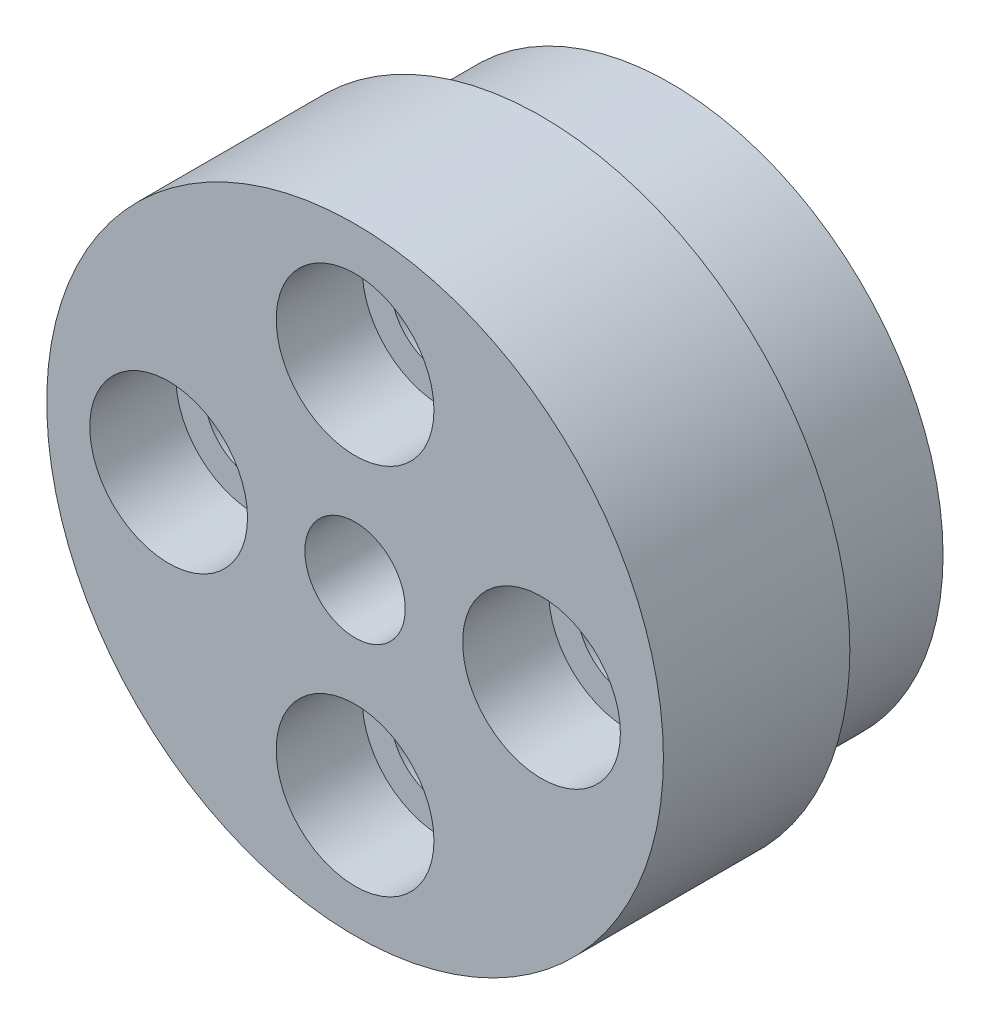
ISO-10303-21;
HEADER;
FILE_DESCRIPTION(('STEP AP214'),'2;1');
FILE_NAME('part.step','',(''),(''),'','','');
FILE_SCHEMA(('AUTOMOTIVE_DESIGN { 1 0 10303 214 1 1 1 1 }'));
ENDSEC;
DATA;
#1=APPLICATION_CONTEXT('core data for automotive mechanical design processes');
#2=APPLICATION_PROTOCOL_DEFINITION('international standard','automotive_design',2000,#1);
#3=PRODUCT_CONTEXT('',#1,'mechanical');
#4=PRODUCT('Part','Part','',(#3));
#5=PRODUCT_RELATED_PRODUCT_CATEGORY('part','',(#4));
#6=PRODUCT_DEFINITION_FORMATION('','',#4);
#7=PRODUCT_DEFINITION_CONTEXT('part definition',#1,'design');
#8=PRODUCT_DEFINITION('design','',#6,#7);
#9=PRODUCT_DEFINITION_SHAPE('','',#8);
#10=(LENGTH_UNIT() NAMED_UNIT(*) SI_UNIT(.MILLI.,.METRE.));
#11=(NAMED_UNIT(*) PLANE_ANGLE_UNIT() SI_UNIT($,.RADIAN.));
#12=(NAMED_UNIT(*) SI_UNIT($,.STERADIAN.) SOLID_ANGLE_UNIT());
#13=UNCERTAINTY_MEASURE_WITH_UNIT(LENGTH_MEASURE(1.E-05),#10,'distance_accuracy_value','');
#14=(GEOMETRIC_REPRESENTATION_CONTEXT(3) GLOBAL_UNCERTAINTY_ASSIGNED_CONTEXT((#13)) GLOBAL_UNIT_ASSIGNED_CONTEXT((#10,
#11,#12)) REPRESENTATION_CONTEXT('',''));
#15=CARTESIAN_POINT('',(0.,0.,0.));
#16=DIRECTION('',(0.,0.,1.));
#17=DIRECTION('',(1.,0.,0.));
#18=AXIS2_PLACEMENT_3D('',#15,#16,#17);
#19=CARTESIAN_POINT('',(0.,-6.5,0.));
#20=DIRECTION('',(0.,0.,-1.));
#21=DIRECTION('',(-1.,0.,0.));
#22=AXIS2_PLACEMENT_3D('',#19,#20,#21);
#23=CYLINDRICAL_SURFACE('',#22,1.75);
#24=CARTESIAN_POINT('',(0.,-6.5,-11.));
#25=DIRECTION('',(0.,0.,-1.));
#26=DIRECTION('',(-1.,0.,0.));
#27=AXIS2_PLACEMENT_3D('',#24,#25,#26);
#28=CIRCLE('',#27,1.75);
#29=CARTESIAN_POINT('',(-1.75,-6.5,-11.));
#30=VERTEX_POINT('',#29);
#31=EDGE_CURVE('E69',#30,#30,#28,.T.);
#32=ORIENTED_EDGE('',*,*,#31,.T.);
#33=EDGE_LOOP('',(#32));
#34=FACE_BOUND('',#33,.T.);
#35=CARTESIAN_POINT('',(0.,-6.5,-3.));
#36=DIRECTION('',(0.,0.,1.));
#37=DIRECTION('',(1.,0.,0.));
#38=AXIS2_PLACEMENT_3D('',#35,#36,#37);
#39=CIRCLE('',#38,1.75);
#40=CARTESIAN_POINT('',(1.75,-6.5,-3.));
#41=VERTEX_POINT('',#40);
#42=EDGE_CURVE('E84',#41,#41,#39,.T.);
#43=ORIENTED_EDGE('',*,*,#42,.T.);
#44=EDGE_LOOP('',(#43));
#45=FACE_BOUND('',#44,.T.);
#46=ADVANCED_FACE('F33',(#34,#45),#23,.F.);
#47=CARTESIAN_POINT('',(-6.5,0.,0.));
#48=DIRECTION('',(0.,0.,-1.));
#49=DIRECTION('',(-1.,0.,0.));
#50=AXIS2_PLACEMENT_3D('',#47,#48,#49);
#51=CYLINDRICAL_SURFACE('',#50,1.75);
#52=CARTESIAN_POINT('',(-6.5,0.,-11.));
#53=DIRECTION('',(0.,0.,-1.));
#54=DIRECTION('',(-1.,0.,0.));
#55=AXIS2_PLACEMENT_3D('',#52,#53,#54);
#56=CIRCLE('',#55,1.75);
#57=CARTESIAN_POINT('',(-8.25,0.,-11.));
#58=VERTEX_POINT('',#57);
#59=EDGE_CURVE('E62',#58,#58,#56,.T.);
#60=ORIENTED_EDGE('',*,*,#59,.T.);
#61=EDGE_LOOP('',(#60));
#62=FACE_BOUND('',#61,.T.);
#63=CARTESIAN_POINT('',(-6.5,0.,-3.));
#64=DIRECTION('',(0.,0.,1.));
#65=DIRECTION('',(1.,0.,0.));
#66=AXIS2_PLACEMENT_3D('',#63,#64,#65);
#67=CIRCLE('',#66,1.75);
#68=CARTESIAN_POINT('',(-4.75,0.,-3.));
#69=VERTEX_POINT('',#68);
#70=EDGE_CURVE('E87',#69,#69,#67,.T.);
#71=ORIENTED_EDGE('',*,*,#70,.T.);
#72=EDGE_LOOP('',(#71));
#73=FACE_BOUND('',#72,.T.);
#74=ADVANCED_FACE('F160',(#62,#73),#51,.F.);
#75=CARTESIAN_POINT('',(6.5,0.,0.));
#76=DIRECTION('',(0.,0.,-1.));
#77=DIRECTION('',(-1.,0.,0.));
#78=AXIS2_PLACEMENT_3D('',#75,#76,#77);
#79=CYLINDRICAL_SURFACE('',#78,1.75);
#80=CARTESIAN_POINT('',(6.5,0.,-11.));
#81=DIRECTION('',(0.,0.,-1.));
#82=DIRECTION('',(-1.,0.,0.));
#83=AXIS2_PLACEMENT_3D('',#80,#81,#82);
#84=CIRCLE('',#83,1.75);
#85=CARTESIAN_POINT('',(4.75,0.,-11.));
#86=VERTEX_POINT('',#85);
#87=EDGE_CURVE('E57',#86,#86,#84,.T.);
#88=ORIENTED_EDGE('',*,*,#87,.T.);
#89=EDGE_LOOP('',(#88));
#90=FACE_BOUND('',#89,.T.);
#91=CARTESIAN_POINT('',(6.5,0.,-3.));
#92=DIRECTION('',(0.,0.,1.));
#93=DIRECTION('',(1.,0.,0.));
#94=AXIS2_PLACEMENT_3D('',#91,#92,#93);
#95=CIRCLE('',#94,1.75);
#96=CARTESIAN_POINT('',(8.25,0.,-3.));
#97=VERTEX_POINT('',#96);
#98=EDGE_CURVE('E105',#97,#97,#95,.T.);
#99=ORIENTED_EDGE('',*,*,#98,.T.);
#100=EDGE_LOOP('',(#99));
#101=FACE_BOUND('',#100,.T.);
#102=ADVANCED_FACE('F116',(#90,#101),#79,.F.);
#103=CARTESIAN_POINT('',(0.,6.5,0.));
#104=DIRECTION('',(0.,0.,-1.));
#105=DIRECTION('',(-1.,0.,0.));
#106=AXIS2_PLACEMENT_3D('',#103,#104,#105);
#107=CYLINDRICAL_SURFACE('',#106,1.75);
#108=CARTESIAN_POINT('',(0.,6.5,-11.));
#109=DIRECTION('',(0.,0.,-1.));
#110=DIRECTION('',(-1.,0.,0.));
#111=AXIS2_PLACEMENT_3D('',#108,#109,#110);
#112=CIRCLE('',#111,1.75);
#113=CARTESIAN_POINT('',(-1.75,6.5,-11.));
#114=VERTEX_POINT('',#113);
#115=EDGE_CURVE('E53',#114,#114,#112,.T.);
#116=ORIENTED_EDGE('',*,*,#115,.T.);
#117=EDGE_LOOP('',(#116));
#118=FACE_BOUND('',#117,.T.);
#119=CARTESIAN_POINT('',(0.,6.5,-3.));
#120=DIRECTION('',(0.,0.,1.));
#121=DIRECTION('',(1.,0.,0.));
#122=AXIS2_PLACEMENT_3D('',#119,#120,#121);
#123=CIRCLE('',#122,1.75);
#124=CARTESIAN_POINT('',(1.75,6.5,-3.));
#125=VERTEX_POINT('',#124);
#126=EDGE_CURVE('E96',#125,#125,#123,.T.);
#127=ORIENTED_EDGE('',*,*,#126,.T.);
#128=EDGE_LOOP('',(#127));
#129=FACE_BOUND('',#128,.T.);
#130=ADVANCED_FACE('F182',(#118,#129),#107,.F.);
#131=CARTESIAN_POINT('',(0.,0.,-11.));
#132=DIRECTION('',(0.,0.,1.));
#133=DIRECTION('',(1.,0.,0.));
#134=AXIS2_PLACEMENT_3D('',#131,#132,#133);
#135=CYLINDRICAL_SURFACE('',#134,9.5);
#136=CARTESIAN_POINT('',(0.,0.,-11.));
#137=DIRECTION('',(0.,0.,1.));
#138=DIRECTION('',(1.,0.,0.));
#139=AXIS2_PLACEMENT_3D('',#136,#137,#138);
#140=CIRCLE('',#139,9.5);
#141=CARTESIAN_POINT('',(9.5,0.,-11.));
#142=VERTEX_POINT('',#141);
#143=EDGE_CURVE('E10',#142,#142,#140,.T.);
#144=ORIENTED_EDGE('',*,*,#143,.T.);
#145=EDGE_LOOP('',(#144));
#146=FACE_BOUND('',#145,.T.);
#147=CARTESIAN_POINT('',(0.,0.,-6.5));
#148=DIRECTION('',(0.,0.,1.));
#149=DIRECTION('',(1.,0.,0.));
#150=AXIS2_PLACEMENT_3D('',#147,#148,#149);
#151=CIRCLE('',#150,9.5);
#152=CARTESIAN_POINT('',(9.5,0.,-6.5));
#153=VERTEX_POINT('',#152);
#154=EDGE_CURVE('E44',#153,#153,#151,.T.);
#155=ORIENTED_EDGE('',*,*,#154,.F.);
#156=EDGE_LOOP('',(#155));
#157=FACE_BOUND('',#156,.T.);
#158=ADVANCED_FACE('F35',(#146,#157),#135,.T.);
#159=CARTESIAN_POINT('',(0.,0.,-11.));
#160=DIRECTION('',(0.,0.,1.));
#161=DIRECTION('',(1.,0.,0.));
#162=AXIS2_PLACEMENT_3D('',#159,#160,#161);
#163=PLANE('',#162);
#164=CARTESIAN_POINT('',(0.,0.,-11.));
#165=DIRECTION('',(0.,0.,-1.));
#166=DIRECTION('',(-1.,0.,0.));
#167=AXIS2_PLACEMENT_3D('',#164,#165,#166);
#168=CIRCLE('',#167,1.75);
#169=CARTESIAN_POINT('',(-1.75,0.,-11.));
#170=VERTEX_POINT('',#169);
#171=EDGE_CURVE('E65',#170,#170,#168,.T.);
#172=ORIENTED_EDGE('',*,*,#171,.F.);
#173=EDGE_LOOP('',(#172));
#174=FACE_BOUND('',#173,.T.);
#175=ORIENTED_EDGE('',*,*,#115,.F.);
#176=EDGE_LOOP('',(#175));
#177=FACE_BOUND('',#176,.T.);
#178=ORIENTED_EDGE('',*,*,#87,.F.);
#179=EDGE_LOOP('',(#178));
#180=FACE_BOUND('',#179,.T.);
#181=ORIENTED_EDGE('',*,*,#59,.F.);
#182=EDGE_LOOP('',(#181));
#183=FACE_BOUND('',#182,.T.);
#184=ORIENTED_EDGE('',*,*,#31,.F.);
#185=EDGE_LOOP('',(#184));
#186=FACE_BOUND('',#185,.T.);
#187=ORIENTED_EDGE('',*,*,#143,.F.);
#188=EDGE_LOOP('',(#187));
#189=FACE_BOUND('',#188,.T.);
#190=ADVANCED_FACE('F176',(#174,#177,#180,#183,#186,#189),#163,.F.);
#191=CARTESIAN_POINT('',(0.,0.,-6.5));
#192=DIRECTION('',(0.,0.,1.));
#193=DIRECTION('',(1.,0.,0.));
#194=AXIS2_PLACEMENT_3D('',#191,#192,#193);
#195=CYLINDRICAL_SURFACE('',#194,10.75);
#196=CARTESIAN_POINT('',(0.,0.,-6.5));
#197=DIRECTION('',(0.,0.,1.));
#198=DIRECTION('',(1.,0.,0.));
#199=AXIS2_PLACEMENT_3D('',#196,#197,#198);
#200=CIRCLE('',#199,10.75);
#201=CARTESIAN_POINT('',(10.75,0.,-6.5));
#202=VERTEX_POINT('',#201);
#203=EDGE_CURVE('E40',#202,#202,#200,.T.);
#204=CARTESIAN_POINT('',(0.,0.,0.));
#205=DIRECTION('',(0.,0.,1.));
#206=DIRECTION('',(1.,0.,0.));
#207=AXIS2_PLACEMENT_3D('',#204,#205,#206);
#208=CIRCLE('',#207,10.75);
#209=CARTESIAN_POINT('',(10.75,0.,0.));
#210=VERTEX_POINT('',#209);
#211=EDGE_CURVE('E49',#210,#210,#208,.T.);
#212=CARTESIAN_POINT('',(10.75,0.,-6.5));
#213=CARTESIAN_POINT('',(10.75,0.,-6.43229166666667));
#214=CARTESIAN_POINT('',(10.75,0.,-6.36458333333333));
#215=CARTESIAN_POINT('',(10.75,0.,-6.22916666666667));
#216=CARTESIAN_POINT('',(10.75,0.,-6.16145833333333));
#217=CARTESIAN_POINT('',(10.75,0.,-6.02604166666667));
#218=CARTESIAN_POINT('',(10.75,0.,-5.95833333333333));
#219=CARTESIAN_POINT('',(10.75,0.,-5.82291666666667));
#220=CARTESIAN_POINT('',(10.75,0.,-5.75520833333333));
#221=CARTESIAN_POINT('',(10.75,0.,-5.61979166666667));
#222=CARTESIAN_POINT('',(10.75,0.,-5.55208333333333));
#223=CARTESIAN_POINT('',(10.75,0.,-5.41666666666667));
#224=CARTESIAN_POINT('',(10.75,0.,-5.34895833333333));
#225=CARTESIAN_POINT('',(10.75,0.,-5.21354166666667));
#226=CARTESIAN_POINT('',(10.75,0.,-5.14583333333333));
#227=CARTESIAN_POINT('',(10.75,0.,-5.01041666666667));
#228=CARTESIAN_POINT('',(10.75,0.,-4.94270833333333));
#229=CARTESIAN_POINT('',(10.75,0.,-4.80729166666667));
#230=CARTESIAN_POINT('',(10.75,0.,-4.73958333333333));
#231=CARTESIAN_POINT('',(10.75,0.,-4.60416666666667));
#232=CARTESIAN_POINT('',(10.75,0.,-4.53645833333333));
#233=CARTESIAN_POINT('',(10.75,0.,-4.40104166666667));
#234=CARTESIAN_POINT('',(10.75,0.,-4.33333333333333));
#235=CARTESIAN_POINT('',(10.75,0.,-4.19791666666667));
#236=CARTESIAN_POINT('',(10.75,0.,-4.13020833333333));
#237=CARTESIAN_POINT('',(10.75,0.,-3.99479166666667));
#238=CARTESIAN_POINT('',(10.75,0.,-3.92708333333333));
#239=CARTESIAN_POINT('',(10.75,0.,-3.79166666666667));
#240=CARTESIAN_POINT('',(10.75,0.,-3.72395833333333));
#241=CARTESIAN_POINT('',(10.75,0.,-3.58854166666667));
#242=CARTESIAN_POINT('',(10.75,0.,-3.52083333333333));
#243=CARTESIAN_POINT('',(10.75,0.,-3.38541666666667));
#244=CARTESIAN_POINT('',(10.75,0.,-3.31770833333333));
#245=CARTESIAN_POINT('',(10.75,0.,-3.18229166666667));
#246=CARTESIAN_POINT('',(10.75,0.,-3.11458333333333));
#247=CARTESIAN_POINT('',(10.75,0.,-2.97916666666667));
#248=CARTESIAN_POINT('',(10.75,0.,-2.91145833333333));
#249=CARTESIAN_POINT('',(10.75,0.,-2.77604166666667));
#250=CARTESIAN_POINT('',(10.75,0.,-2.70833333333333));
#251=CARTESIAN_POINT('',(10.75,0.,-2.57291666666667));
#252=CARTESIAN_POINT('',(10.75,0.,-2.50520833333333));
#253=CARTESIAN_POINT('',(10.75,0.,-2.36979166666667));
#254=CARTESIAN_POINT('',(10.75,0.,-2.30208333333333));
#255=CARTESIAN_POINT('',(10.75,0.,-2.16666666666667));
#256=CARTESIAN_POINT('',(10.75,0.,-2.09895833333333));
#257=CARTESIAN_POINT('',(10.75,0.,-1.96354166666667));
#258=CARTESIAN_POINT('',(10.75,0.,-1.89583333333333));
#259=CARTESIAN_POINT('',(10.75,0.,-1.76041666666667));
#260=CARTESIAN_POINT('',(10.75,0.,-1.69270833333333));
#261=CARTESIAN_POINT('',(10.75,0.,-1.55729166666667));
#262=CARTESIAN_POINT('',(10.75,0.,-1.48958333333333));
#263=CARTESIAN_POINT('',(10.75,0.,-1.35416666666667));
#264=CARTESIAN_POINT('',(10.75,0.,-1.28645833333333));
#265=CARTESIAN_POINT('',(10.75,0.,-1.15104166666667));
#266=CARTESIAN_POINT('',(10.75,0.,-1.08333333333333));
#267=CARTESIAN_POINT('',(10.75,0.,-0.947916666666667));
#268=CARTESIAN_POINT('',(10.75,0.,-0.880208333333333));
#269=CARTESIAN_POINT('',(10.75,0.,-0.744791666666667));
#270=CARTESIAN_POINT('',(10.75,0.,-0.677083333333333));
#271=CARTESIAN_POINT('',(10.75,0.,-0.541666666666667));
#272=CARTESIAN_POINT('',(10.75,0.,-0.473958333333333));
#273=CARTESIAN_POINT('',(10.75,0.,-0.338541666666667));
#274=CARTESIAN_POINT('',(10.75,0.,-0.270833333333334));
#275=CARTESIAN_POINT('',(10.75,0.,-0.135416666666667));
#276=CARTESIAN_POINT('',(10.75,0.,-0.0677083333333334));
#277=CARTESIAN_POINT('',(10.75,0.,0.));
#278=B_SPLINE_CURVE_WITH_KNOTS('',3,(#212,#213,#214,#215,#216,#217,#218,#219,#220,#221,#222,
#223,#224,#225,#226,#227,#228,#229,#230,#231,#232,#233,#234,#235,#236,#237,#238,#239,#240,#241,
#242,#243,#244,#245,#246,#247,#248,#249,#250,#251,#252,#253,#254,#255,#256,#257,#258,#259,#260,
#261,#262,#263,#264,#265,#266,#267,#268,#269,#270,#271,#272,#273,#274,#275,#276,#277),
.UNSPECIFIED.,.F.,.F.,(4,2,2,2,2,2,2,2,2,2,2,2,2,2,2,2,2,2,2,2,2,2,2,2,2,2,2,2,2,2,2,2,4),(0.,
0.203124999999999,0.40625,0.609375,0.8125,1.015625,1.21875,1.421875,1.625,1.828125,2.03125,
2.234375,2.4375,2.640625,2.84375,3.046875,3.25,3.453125,3.65625,3.859375,4.0625,4.265625,
4.46875,4.671875,4.875,5.078125,5.28125,5.484375,5.6875,5.890625,6.09375,6.296875,6.5),.UNSPECIFIED.);
#279=EDGE_CURVE('BSEAM172',#202,#210,#278,.T.);
#280=ORIENTED_EDGE('',*,*,#203,.T.);
#281=ORIENTED_EDGE('',*,*,#211,.F.);
#282=ORIENTED_EDGE('',*,*,#279,.T.);
#283=ORIENTED_EDGE('',*,*,#279,.F.);
#284=EDGE_LOOP('',(#280,#282,#281,#283));
#285=FACE_BOUND('',#284,.T.);
#286=ADVANCED_FACE('F172',(#285),#195,.T.);
#287=CARTESIAN_POINT('',(0.,0.,-6.5));
#288=DIRECTION('',(0.,0.,1.));
#289=DIRECTION('',(1.,0.,0.));
#290=AXIS2_PLACEMENT_3D('',#287,#288,#289);
#291=PLANE('',#290);
#292=ORIENTED_EDGE('',*,*,#154,.T.);
#293=EDGE_LOOP('',(#292));
#294=FACE_BOUND('',#293,.T.);
#295=ORIENTED_EDGE('',*,*,#203,.F.);
#296=EDGE_LOOP('',(#295));
#297=FACE_BOUND('',#296,.T.);
#298=ADVANCED_FACE('F136',(#294,#297),#291,.F.);
#299=CARTESIAN_POINT('',(0.,0.,0.));
#300=DIRECTION('',(0.,0.,1.));
#301=DIRECTION('',(1.,0.,0.));
#302=AXIS2_PLACEMENT_3D('',#299,#300,#301);
#303=PLANE('',#302);
#304=CARTESIAN_POINT('',(6.5,0.,0.));
#305=DIRECTION('',(0.,0.,1.));
#306=DIRECTION('',(1.,0.,0.));
#307=AXIS2_PLACEMENT_3D('',#304,#305,#306);
#308=CIRCLE('',#307,2.75);
#309=CARTESIAN_POINT('',(9.25,0.,0.));
#310=VERTEX_POINT('',#309);
#311=EDGE_CURVE('E108',#310,#310,#308,.T.);
#312=ORIENTED_EDGE('',*,*,#311,.F.);
#313=EDGE_LOOP('',(#312));
#314=FACE_BOUND('',#313,.T.);
#315=CARTESIAN_POINT('',(0.,6.5,0.));
#316=DIRECTION('',(0.,0.,1.));
#317=DIRECTION('',(1.,0.,0.));
#318=AXIS2_PLACEMENT_3D('',#315,#316,#317);
#319=CIRCLE('',#318,2.75);
#320=CARTESIAN_POINT('',(2.75,6.5,0.));
#321=VERTEX_POINT('',#320);
#322=EDGE_CURVE('E99',#321,#321,#319,.T.);
#323=ORIENTED_EDGE('',*,*,#322,.F.);
#324=EDGE_LOOP('',(#323));
#325=FACE_BOUND('',#324,.T.);
#326=CARTESIAN_POINT('',(-6.5,0.,0.));
#327=DIRECTION('',(0.,0.,1.));
#328=DIRECTION('',(1.,0.,0.));
#329=AXIS2_PLACEMENT_3D('',#326,#327,#328);
#330=CIRCLE('',#329,2.75);
#331=CARTESIAN_POINT('',(-3.75,0.,0.));
#332=VERTEX_POINT('',#331);
#333=EDGE_CURVE('E90',#332,#332,#330,.T.);
#334=ORIENTED_EDGE('',*,*,#333,.F.);
#335=EDGE_LOOP('',(#334));
#336=FACE_BOUND('',#335,.T.);
#337=CARTESIAN_POINT('',(0.,-6.5,0.));
#338=DIRECTION('',(0.,0.,1.));
#339=DIRECTION('',(1.,0.,0.));
#340=AXIS2_PLACEMENT_3D('',#337,#338,#339);
#341=CIRCLE('',#340,2.75);
#342=CARTESIAN_POINT('',(2.75,-6.5,0.));
#343=VERTEX_POINT('',#342);
#344=EDGE_CURVE('E80',#343,#343,#341,.T.);
#345=ORIENTED_EDGE('',*,*,#344,.F.);
#346=EDGE_LOOP('',(#345));
#347=FACE_BOUND('',#346,.T.);
#348=CARTESIAN_POINT('',(0.,0.,0.));
#349=DIRECTION('',(0.,0.,-1.));
#350=DIRECTION('',(-1.,0.,0.));
#351=AXIS2_PLACEMENT_3D('',#348,#349,#350);
#352=CIRCLE('',#351,1.75);
#353=CARTESIAN_POINT('',(-1.75,0.,0.));
#354=VERTEX_POINT('',#353);
#355=EDGE_CURVE('E71',#354,#354,#352,.T.);
#356=ORIENTED_EDGE('',*,*,#355,.T.);
#357=EDGE_LOOP('',(#356));
#358=FACE_BOUND('',#357,.T.);
#359=ORIENTED_EDGE('',*,*,#211,.T.);
#360=EDGE_LOOP('',(#359));
#361=FACE_BOUND('',#360,.T.);
#362=ADVANCED_FACE('F132',(#314,#325,#336,#347,#358,#361),#303,.T.);
#363=CARTESIAN_POINT('',(0.,0.,0.));
#364=DIRECTION('',(0.,0.,-1.));
#365=DIRECTION('',(-1.,0.,0.));
#366=AXIS2_PLACEMENT_3D('',#363,#364,#365);
#367=CYLINDRICAL_SURFACE('',#366,1.75);
#368=ORIENTED_EDGE('',*,*,#355,.F.);
#369=EDGE_LOOP('',(#368));
#370=FACE_BOUND('',#369,.T.);
#371=ORIENTED_EDGE('',*,*,#171,.T.);
#372=EDGE_LOOP('',(#371));
#373=FACE_BOUND('',#372,.T.);
#374=ADVANCED_FACE('F135',(#370,#373),#367,.F.);
#375=CARTESIAN_POINT('',(0.,6.5,-3.));
#376=DIRECTION('',(0.,0.,1.));
#377=DIRECTION('',(1.,0.,0.));
#378=AXIS2_PLACEMENT_3D('',#375,#376,#377);
#379=CYLINDRICAL_SURFACE('',#378,2.75);
#380=CARTESIAN_POINT('',(0.,6.5,-3.));
#381=DIRECTION('',(0.,0.,1.));
#382=DIRECTION('',(1.,0.,0.));
#383=AXIS2_PLACEMENT_3D('',#380,#381,#382);
#384=CIRCLE('',#383,2.75);
#385=CARTESIAN_POINT('',(2.75,6.5,-3.));
#386=VERTEX_POINT('',#385);
#387=EDGE_CURVE('E102',#386,#386,#384,.T.);
#388=ORIENTED_EDGE('',*,*,#387,.F.);
#389=EDGE_LOOP('',(#388));
#390=FACE_BOUND('',#389,.T.);
#391=ORIENTED_EDGE('',*,*,#322,.T.);
#392=EDGE_LOOP('',(#391));
#393=FACE_BOUND('',#392,.T.);
#394=ADVANCED_FACE('F202',(#390,#393),#379,.F.);
#395=CARTESIAN_POINT('',(0.,6.5,-3.));
#396=DIRECTION('',(0.,0.,1.));
#397=DIRECTION('',(1.,0.,0.));
#398=AXIS2_PLACEMENT_3D('',#395,#396,#397);
#399=PLANE('',#398);
#400=ORIENTED_EDGE('',*,*,#126,.F.);
#401=EDGE_LOOP('',(#400));
#402=FACE_BOUND('',#401,.T.);
#403=ORIENTED_EDGE('',*,*,#387,.T.);
#404=EDGE_LOOP('',(#403));
#405=FACE_BOUND('',#404,.T.);
#406=ADVANCED_FACE('F128',(#402,#405),#399,.T.);
#407=CARTESIAN_POINT('',(6.5,0.,-3.));
#408=DIRECTION('',(0.,0.,1.));
#409=DIRECTION('',(1.,0.,0.));
#410=AXIS2_PLACEMENT_3D('',#407,#408,#409);
#411=CYLINDRICAL_SURFACE('',#410,2.75);
#412=CARTESIAN_POINT('',(6.5,0.,-3.));
#413=DIRECTION('',(0.,0.,1.));
#414=DIRECTION('',(1.,0.,0.));
#415=AXIS2_PLACEMENT_3D('',#412,#413,#414);
#416=CIRCLE('',#415,2.75);
#417=CARTESIAN_POINT('',(9.25,0.,-3.));
#418=VERTEX_POINT('',#417);
#419=EDGE_CURVE('E78',#418,#418,#416,.T.);
#420=ORIENTED_EDGE('',*,*,#419,.F.);
#421=EDGE_LOOP('',(#420));
#422=FACE_BOUND('',#421,.T.);
#423=ORIENTED_EDGE('',*,*,#311,.T.);
#424=EDGE_LOOP('',(#423));
#425=FACE_BOUND('',#424,.T.);
#426=ADVANCED_FACE('F122',(#422,#425),#411,.F.);
#427=CARTESIAN_POINT('',(6.5,0.,-3.));
#428=DIRECTION('',(0.,0.,1.));
#429=DIRECTION('',(1.,0.,0.));
#430=AXIS2_PLACEMENT_3D('',#427,#428,#429);
#431=PLANE('',#430);
#432=ORIENTED_EDGE('',*,*,#98,.F.);
#433=EDGE_LOOP('',(#432));
#434=FACE_BOUND('',#433,.T.);
#435=ORIENTED_EDGE('',*,*,#419,.T.);
#436=EDGE_LOOP('',(#435));
#437=FACE_BOUND('',#436,.T.);
#438=ADVANCED_FACE('F118',(#434,#437),#431,.T.);
#439=CARTESIAN_POINT('',(-6.5,0.,-3.));
#440=DIRECTION('',(0.,0.,1.));
#441=DIRECTION('',(1.,0.,0.));
#442=AXIS2_PLACEMENT_3D('',#439,#440,#441);
#443=CYLINDRICAL_SURFACE('',#442,2.75);
#444=CARTESIAN_POINT('',(-6.5,0.,-3.));
#445=DIRECTION('',(0.,0.,1.));
#446=DIRECTION('',(1.,0.,0.));
#447=AXIS2_PLACEMENT_3D('',#444,#445,#446);
#448=CIRCLE('',#447,2.75);
#449=CARTESIAN_POINT('',(-3.75,0.,-3.));
#450=VERTEX_POINT('',#449);
#451=EDGE_CURVE('E93',#450,#450,#448,.T.);
#452=ORIENTED_EDGE('',*,*,#451,.F.);
#453=EDGE_LOOP('',(#452));
#454=FACE_BOUND('',#453,.T.);
#455=ORIENTED_EDGE('',*,*,#333,.T.);
#456=EDGE_LOOP('',(#455));
#457=FACE_BOUND('',#456,.T.);
#458=ADVANCED_FACE('F121',(#454,#457),#443,.F.);
#459=CARTESIAN_POINT('',(-6.5,0.,-3.));
#460=DIRECTION('',(0.,0.,1.));
#461=DIRECTION('',(1.,0.,0.));
#462=AXIS2_PLACEMENT_3D('',#459,#460,#461);
#463=PLANE('',#462);
#464=ORIENTED_EDGE('',*,*,#70,.F.);
#465=EDGE_LOOP('',(#464));
#466=FACE_BOUND('',#465,.T.);
#467=ORIENTED_EDGE('',*,*,#451,.T.);
#468=EDGE_LOOP('',(#467));
#469=FACE_BOUND('',#468,.T.);
#470=ADVANCED_FACE('F146',(#466,#469),#463,.T.);
#471=CARTESIAN_POINT('',(0.,-6.5,-3.));
#472=DIRECTION('',(0.,0.,1.));
#473=DIRECTION('',(1.,0.,0.));
#474=AXIS2_PLACEMENT_3D('',#471,#472,#473);
#475=CYLINDRICAL_SURFACE('',#474,2.75);
#476=CARTESIAN_POINT('',(0.,-6.5,-3.));
#477=DIRECTION('',(0.,0.,1.));
#478=DIRECTION('',(1.,0.,0.));
#479=AXIS2_PLACEMENT_3D('',#476,#477,#478);
#480=CIRCLE('',#479,2.75);
#481=CARTESIAN_POINT('',(2.75,-6.5,-3.));
#482=VERTEX_POINT('',#481);
#483=EDGE_CURVE('E83',#482,#482,#480,.T.);
#484=ORIENTED_EDGE('',*,*,#483,.F.);
#485=EDGE_LOOP('',(#484));
#486=FACE_BOUND('',#485,.T.);
#487=ORIENTED_EDGE('',*,*,#344,.T.);
#488=EDGE_LOOP('',(#487));
#489=FACE_BOUND('',#488,.T.);
#490=ADVANCED_FACE('F143',(#486,#489),#475,.F.);
#491=CARTESIAN_POINT('',(0.,-6.5,-3.));
#492=DIRECTION('',(0.,0.,1.));
#493=DIRECTION('',(1.,0.,0.));
#494=AXIS2_PLACEMENT_3D('',#491,#492,#493);
#495=PLANE('',#494);
#496=ORIENTED_EDGE('',*,*,#42,.F.);
#497=EDGE_LOOP('',(#496));
#498=FACE_BOUND('',#497,.T.);
#499=ORIENTED_EDGE('',*,*,#483,.T.);
#500=EDGE_LOOP('',(#499));
#501=FACE_BOUND('',#500,.T.);
#502=ADVANCED_FACE('F145',(#498,#501),#495,.T.);
#503=CLOSED_SHELL('',(#46,#74,#102,#130,#158,#190,#286,#298,#362,#374,#394,#406,#426,#438,#458,
#470,#490,#502));
#504=MANIFOLD_SOLID_BREP('B2',#503);
#505=ADVANCED_BREP_SHAPE_REPRESENTATION('',(#18,#504),#14);
#506=SHAPE_DEFINITION_REPRESENTATION(#9,#505);
ENDSEC;
END-ISO-10303-21;
